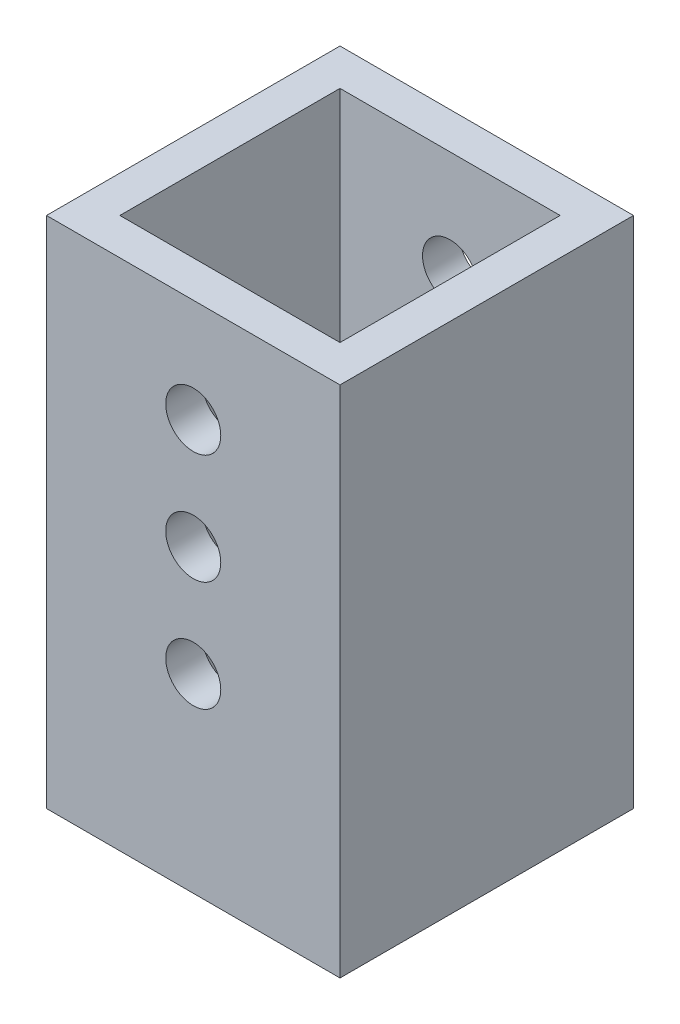
ISO-10303-21;
HEADER;
FILE_DESCRIPTION(('STEP AP214'),'2;1');
FILE_NAME('part.step','',(''),(''),'','','');
FILE_SCHEMA(('AUTOMOTIVE_DESIGN { 1 0 10303 214 1 1 1 1 }'));
ENDSEC;
DATA;
#1=APPLICATION_CONTEXT('core data for automotive mechanical design processes');
#2=APPLICATION_PROTOCOL_DEFINITION('international standard','automotive_design',2000,#1);
#3=PRODUCT_CONTEXT('',#1,'mechanical');
#4=PRODUCT('Part','Part','',(#3));
#5=PRODUCT_RELATED_PRODUCT_CATEGORY('part','',(#4));
#6=PRODUCT_DEFINITION_FORMATION('','',#4);
#7=PRODUCT_DEFINITION_CONTEXT('part definition',#1,'design');
#8=PRODUCT_DEFINITION('design','',#6,#7);
#9=PRODUCT_DEFINITION_SHAPE('','',#8);
#10=(LENGTH_UNIT() NAMED_UNIT(*) SI_UNIT(.MILLI.,.METRE.));
#11=(NAMED_UNIT(*) PLANE_ANGLE_UNIT() SI_UNIT($,.RADIAN.));
#12=(NAMED_UNIT(*) SI_UNIT($,.STERADIAN.) SOLID_ANGLE_UNIT());
#13=UNCERTAINTY_MEASURE_WITH_UNIT(LENGTH_MEASURE(1.E-05),#10,'distance_accuracy_value','');
#14=(GEOMETRIC_REPRESENTATION_CONTEXT(3) GLOBAL_UNCERTAINTY_ASSIGNED_CONTEXT((#13)) GLOBAL_UNIT_ASSIGNED_CONTEXT((#10,
#11,#12)) REPRESENTATION_CONTEXT('',''));
#15=CARTESIAN_POINT('',(0.,0.,0.));
#16=DIRECTION('',(0.,0.,1.));
#17=DIRECTION('',(1.,0.,0.));
#18=AXIS2_PLACEMENT_3D('',#15,#16,#17);
#19=CARTESIAN_POINT('',(-19.05,0.,-19.05));
#20=DIRECTION('',(-1.,0.,0.));
#21=DIRECTION('',(0.,0.,1.));
#22=AXIS2_PLACEMENT_3D('',#19,#20,#21);
#23=PLANE('',#22);
#24=DIRECTION('',(0.,0.,-1.));
#25=VECTOR('',#24,1.);
#26=CARTESIAN_POINT('',(-19.05,7.62,19.05));
#27=LINE('',#26,#25);
#28=CARTESIAN_POINT('',(-19.05,7.62,19.05));
#29=VERTEX_POINT('',#28);
#30=CARTESIAN_POINT('',(-19.05,7.62,-19.05));
#31=VERTEX_POINT('',#30);
#32=EDGE_CURVE('E52',#29,#31,#27,.T.);
#33=ORIENTED_EDGE('',*,*,#32,.T.);
#34=DIRECTION('',(0.,1.,0.));
#35=VECTOR('',#34,1.);
#36=CARTESIAN_POINT('',(-19.05,0.,-19.05));
#37=LINE('',#36,#35);
#38=CARTESIAN_POINT('',(-19.05,88.9,-19.05));
#39=VERTEX_POINT('',#38);
#40=EDGE_CURVE('E133',#31,#39,#37,.T.);
#41=ORIENTED_EDGE('',*,*,#40,.T.);
#42=DIRECTION('',(0.,0.,1.));
#43=VECTOR('',#42,1.);
#44=CARTESIAN_POINT('',(-19.05,88.9,-19.05));
#45=LINE('',#44,#43);
#46=CARTESIAN_POINT('',(-19.05,88.9,19.05));
#47=VERTEX_POINT('',#46);
#48=EDGE_CURVE('E121',#39,#47,#45,.T.);
#49=ORIENTED_EDGE('',*,*,#48,.T.);
#50=DIRECTION('',(0.,1.,0.));
#51=VECTOR('',#50,1.);
#52=CARTESIAN_POINT('',(-19.05,0.,19.05));
#53=LINE('',#52,#51);
#54=EDGE_CURVE('E113',#29,#47,#53,.T.);
#55=ORIENTED_EDGE('',*,*,#54,.F.);
#56=EDGE_LOOP('',(#33,#41,#49,#55));
#57=FACE_BOUND('',#56,.T.);
#58=ADVANCED_FACE('F36',(#57),#23,.F.);
#59=CARTESIAN_POINT('',(19.05,0.,-19.05));
#60=DIRECTION('',(0.,0.,-1.));
#61=DIRECTION('',(-1.,0.,0.));
#62=AXIS2_PLACEMENT_3D('',#59,#60,#61);
#63=PLANE('',#62);
#64=CARTESIAN_POINT('',(0.,70.9772729319091,-19.05));
#65=DIRECTION('',(0.,0.,-1.));
#66=DIRECTION('',(-1.,0.,0.));
#67=AXIS2_PLACEMENT_3D('',#64,#65,#66);
#68=CIRCLE('',#67,4.76249999999999);
#69=CARTESIAN_POINT('',(-4.76249999999999,70.9772729319091,-19.05));
#70=VERTEX_POINT('',#69);
#71=EDGE_CURVE('E253',#70,#70,#68,.T.);
#72=ORIENTED_EDGE('',*,*,#71,.T.);
#73=EDGE_LOOP('',(#72));
#74=FACE_BOUND('',#73,.T.);
#75=CARTESIAN_POINT('',(0.,51.9272729319091,-19.05));
#76=DIRECTION('',(0.,0.,-1.));
#77=DIRECTION('',(-1.,0.,0.));
#78=AXIS2_PLACEMENT_3D('',#75,#76,#77);
#79=CIRCLE('',#78,4.76249999999999);
#80=CARTESIAN_POINT('',(-4.76249999999999,51.9272729319091,-19.05));
#81=VERTEX_POINT('',#80);
#82=EDGE_CURVE('E254',#81,#81,#79,.T.);
#83=ORIENTED_EDGE('',*,*,#82,.T.);
#84=EDGE_LOOP('',(#83));
#85=FACE_BOUND('',#84,.T.);
#86=CARTESIAN_POINT('',(0.,32.8772729319091,-19.05));
#87=DIRECTION('',(0.,0.,-1.));
#88=DIRECTION('',(-1.,0.,0.));
#89=AXIS2_PLACEMENT_3D('',#86,#87,#88);
#90=CIRCLE('',#89,4.7625);
#91=CARTESIAN_POINT('',(-4.7625,32.8772729319091,-19.05));
#92=VERTEX_POINT('',#91);
#93=EDGE_CURVE('E271',#92,#92,#90,.T.);
#94=ORIENTED_EDGE('',*,*,#93,.T.);
#95=EDGE_LOOP('',(#94));
#96=FACE_BOUND('',#95,.T.);
#97=DIRECTION('',(1.,0.,0.));
#98=VECTOR('',#97,1.);
#99=CARTESIAN_POINT('',(-19.05,7.62,-19.05));
#100=LINE('',#99,#98);
#101=CARTESIAN_POINT('',(19.05,7.62,-19.05));
#102=VERTEX_POINT('',#101);
#103=EDGE_CURVE('E59',#31,#102,#100,.T.);
#104=ORIENTED_EDGE('',*,*,#103,.T.);
#105=DIRECTION('',(0.,1.,0.));
#106=VECTOR('',#105,1.);
#107=CARTESIAN_POINT('',(19.05,0.,-19.05));
#108=LINE('',#107,#106);
#109=CARTESIAN_POINT('',(19.05,88.9,-19.05));
#110=VERTEX_POINT('',#109);
#111=EDGE_CURVE('E112',#102,#110,#108,.T.);
#112=ORIENTED_EDGE('',*,*,#111,.T.);
#113=DIRECTION('',(-1.,0.,0.));
#114=VECTOR('',#113,1.);
#115=CARTESIAN_POINT('',(19.05,88.9,-19.05));
#116=LINE('',#115,#114);
#117=EDGE_CURVE('E130',#110,#39,#116,.T.);
#118=ORIENTED_EDGE('',*,*,#117,.T.);
#119=ORIENTED_EDGE('',*,*,#40,.F.);
#120=EDGE_LOOP('',(#104,#112,#118,#119));
#121=FACE_BOUND('',#120,.T.);
#122=ADVANCED_FACE('F198',(#74,#85,#96,#121),#63,.F.);
#123=CARTESIAN_POINT('',(19.05,0.,-19.05));
#124=DIRECTION('',(1.,0.,0.));
#125=DIRECTION('',(0.,0.,-1.));
#126=AXIS2_PLACEMENT_3D('',#123,#124,#125);
#127=PLANE('',#126);
#128=DIRECTION('',(0.,0.,1.));
#129=VECTOR('',#128,1.);
#130=CARTESIAN_POINT('',(19.05,7.62,19.05));
#131=LINE('',#130,#129);
#132=CARTESIAN_POINT('',(19.05,7.62,19.05));
#133=VERTEX_POINT('',#132);
#134=EDGE_CURVE('E116',#102,#133,#131,.T.);
#135=ORIENTED_EDGE('',*,*,#134,.T.);
#136=DIRECTION('',(0.,1.,0.));
#137=VECTOR('',#136,1.);
#138=CARTESIAN_POINT('',(19.05,0.,19.05));
#139=LINE('',#138,#137);
#140=CARTESIAN_POINT('',(19.05,88.9,19.05));
#141=VERTEX_POINT('',#140);
#142=EDGE_CURVE('E102',#133,#141,#139,.T.);
#143=ORIENTED_EDGE('',*,*,#142,.T.);
#144=DIRECTION('',(0.,0.,-1.));
#145=VECTOR('',#144,1.);
#146=CARTESIAN_POINT('',(19.05,88.9,-19.05));
#147=LINE('',#146,#145);
#148=EDGE_CURVE('E128',#141,#110,#147,.T.);
#149=ORIENTED_EDGE('',*,*,#148,.T.);
#150=ORIENTED_EDGE('',*,*,#111,.F.);
#151=EDGE_LOOP('',(#135,#143,#149,#150));
#152=FACE_BOUND('',#151,.T.);
#153=ADVANCED_FACE('F117',(#152),#127,.F.);
#154=CARTESIAN_POINT('',(19.05,0.,19.05));
#155=DIRECTION('',(0.,0.,1.));
#156=DIRECTION('',(1.,0.,0.));
#157=AXIS2_PLACEMENT_3D('',#154,#155,#156);
#158=PLANE('',#157);
#159=CARTESIAN_POINT('',(0.,70.9772729319091,19.05));
#160=DIRECTION('',(0.,0.,1.));
#161=DIRECTION('',(1.,0.,0.));
#162=AXIS2_PLACEMENT_3D('',#159,#160,#161);
#163=CIRCLE('',#162,4.76249999999999);
#164=CARTESIAN_POINT('',(4.76249999999999,70.9772729319091,19.05));
#165=VERTEX_POINT('',#164);
#166=EDGE_CURVE('E252',#165,#165,#163,.T.);
#167=ORIENTED_EDGE('',*,*,#166,.T.);
#168=EDGE_LOOP('',(#167));
#169=FACE_BOUND('',#168,.T.);
#170=CARTESIAN_POINT('',(0.,51.9272729319091,19.05));
#171=DIRECTION('',(0.,0.,1.));
#172=DIRECTION('',(1.,0.,0.));
#173=AXIS2_PLACEMENT_3D('',#170,#171,#172);
#174=CIRCLE('',#173,4.76249999999999);
#175=CARTESIAN_POINT('',(4.76249999999999,51.9272729319091,19.05));
#176=VERTEX_POINT('',#175);
#177=EDGE_CURVE('E260',#176,#176,#174,.T.);
#178=ORIENTED_EDGE('',*,*,#177,.T.);
#179=EDGE_LOOP('',(#178));
#180=FACE_BOUND('',#179,.T.);
#181=CARTESIAN_POINT('',(0.,32.8772729319091,19.05));
#182=DIRECTION('',(0.,0.,1.));
#183=DIRECTION('',(1.,0.,0.));
#184=AXIS2_PLACEMENT_3D('',#181,#182,#183);
#185=CIRCLE('',#184,4.7625);
#186=CARTESIAN_POINT('',(4.76250000000001,32.8772729319091,19.05));
#187=VERTEX_POINT('',#186);
#188=EDGE_CURVE('E274',#187,#187,#185,.T.);
#189=ORIENTED_EDGE('',*,*,#188,.T.);
#190=EDGE_LOOP('',(#189));
#191=FACE_BOUND('',#190,.T.);
#192=DIRECTION('',(-1.,0.,0.));
#193=VECTOR('',#192,1.);
#194=CARTESIAN_POINT('',(-19.05,7.62,19.05));
#195=LINE('',#194,#193);
#196=EDGE_CURVE('E106',#133,#29,#195,.T.);
#197=ORIENTED_EDGE('',*,*,#196,.T.);
#198=ORIENTED_EDGE('',*,*,#54,.T.);
#199=DIRECTION('',(1.,0.,0.));
#200=VECTOR('',#199,1.);
#201=CARTESIAN_POINT('',(19.05,88.9,19.05));
#202=LINE('',#201,#200);
#203=EDGE_CURVE('E108',#47,#141,#202,.T.);
#204=ORIENTED_EDGE('',*,*,#203,.T.);
#205=ORIENTED_EDGE('',*,*,#142,.F.);
#206=EDGE_LOOP('',(#197,#198,#204,#205));
#207=FACE_BOUND('',#206,.T.);
#208=ADVANCED_FACE('F104',(#169,#180,#191,#207),#158,.F.);
#209=CARTESIAN_POINT('',(-25.4,88.9,-25.4));
#210=DIRECTION('',(1.,0.,0.));
#211=DIRECTION('',(0.,0.,-1.));
#212=AXIS2_PLACEMENT_3D('',#209,#210,#211);
#213=PLANE('',#212);
#214=DIRECTION('',(0.,0.,1.));
#215=VECTOR('',#214,1.);
#216=CARTESIAN_POINT('',(-25.4,0.,-25.4));
#217=LINE('',#216,#215);
#218=CARTESIAN_POINT('',(-25.4,0.,-25.4));
#219=VERTEX_POINT('',#218);
#220=CARTESIAN_POINT('',(-25.4,0.,25.4));
#221=VERTEX_POINT('',#220);
#222=EDGE_CURVE('E135',#219,#221,#217,.T.);
#223=ORIENTED_EDGE('',*,*,#222,.T.);
#224=DIRECTION('',(0.,-1.,0.));
#225=VECTOR('',#224,1.);
#226=CARTESIAN_POINT('',(-25.4,88.9,25.4));
#227=LINE('',#226,#225);
#228=CARTESIAN_POINT('',(-25.4,88.9,25.4));
#229=VERTEX_POINT('',#228);
#230=EDGE_CURVE('E40',#229,#221,#227,.T.);
#231=ORIENTED_EDGE('',*,*,#230,.F.);
#232=DIRECTION('',(0.,0.,1.));
#233=VECTOR('',#232,1.);
#234=CARTESIAN_POINT('',(-25.4,88.9,-25.4));
#235=LINE('',#234,#233);
#236=CARTESIAN_POINT('',(-25.4,88.9,-25.4));
#237=VERTEX_POINT('',#236);
#238=EDGE_CURVE('E138',#237,#229,#235,.T.);
#239=ORIENTED_EDGE('',*,*,#238,.F.);
#240=DIRECTION('',(0.,-1.,0.));
#241=VECTOR('',#240,1.);
#242=CARTESIAN_POINT('',(-25.4,88.9,-25.4));
#243=LINE('',#242,#241);
#244=EDGE_CURVE('E148',#237,#219,#243,.T.);
#245=ORIENTED_EDGE('',*,*,#244,.T.);
#246=EDGE_LOOP('',(#223,#231,#239,#245));
#247=FACE_BOUND('',#246,.T.);
#248=ADVANCED_FACE('F38',(#247),#213,.F.);
#249=CARTESIAN_POINT('',(-25.4,88.9,25.4));
#250=DIRECTION('',(0.,0.,-1.));
#251=DIRECTION('',(-1.,0.,0.));
#252=AXIS2_PLACEMENT_3D('',#249,#250,#251);
#253=PLANE('',#252);
#254=CARTESIAN_POINT('',(0.,70.9772729319091,25.4));
#255=DIRECTION('',(0.,0.,1.));
#256=DIRECTION('',(1.,0.,0.));
#257=AXIS2_PLACEMENT_3D('',#254,#255,#256);
#258=CIRCLE('',#257,4.76249999999999);
#259=CARTESIAN_POINT('',(4.76249999999999,70.9772729319091,25.4));
#260=VERTEX_POINT('',#259);
#261=EDGE_CURVE('E249',#260,#260,#258,.T.);
#262=ORIENTED_EDGE('',*,*,#261,.F.);
#263=EDGE_LOOP('',(#262));
#264=FACE_BOUND('',#263,.T.);
#265=CARTESIAN_POINT('',(0.,51.9272729319091,25.4));
#266=DIRECTION('',(0.,0.,1.));
#267=DIRECTION('',(1.,0.,0.));
#268=AXIS2_PLACEMENT_3D('',#265,#266,#267);
#269=CIRCLE('',#268,4.76249999999999);
#270=CARTESIAN_POINT('',(4.76249999999999,51.9272729319091,25.4));
#271=VERTEX_POINT('',#270);
#272=EDGE_CURVE('E284',#271,#271,#269,.T.);
#273=ORIENTED_EDGE('',*,*,#272,.F.);
#274=EDGE_LOOP('',(#273));
#275=FACE_BOUND('',#274,.T.);
#276=CARTESIAN_POINT('',(0.,32.8772729319091,25.4));
#277=DIRECTION('',(0.,0.,1.));
#278=DIRECTION('',(1.,0.,0.));
#279=AXIS2_PLACEMENT_3D('',#276,#277,#278);
#280=CIRCLE('',#279,4.7625);
#281=CARTESIAN_POINT('',(4.76250000000001,32.8772729319091,25.4));
#282=VERTEX_POINT('',#281);
#283=EDGE_CURVE('E278',#282,#282,#280,.T.);
#284=ORIENTED_EDGE('',*,*,#283,.F.);
#285=EDGE_LOOP('',(#284));
#286=FACE_BOUND('',#285,.T.);
#287=DIRECTION('',(1.,0.,0.));
#288=VECTOR('',#287,1.);
#289=CARTESIAN_POINT('',(-25.4,0.,25.4));
#290=LINE('',#289,#288);
#291=CARTESIAN_POINT('',(25.4,0.,25.4));
#292=VERTEX_POINT('',#291);
#293=EDGE_CURVE('E151',#221,#292,#290,.T.);
#294=ORIENTED_EDGE('',*,*,#293,.T.);
#295=DIRECTION('',(0.,-1.,0.));
#296=VECTOR('',#295,1.);
#297=CARTESIAN_POINT('',(25.4,88.9,25.4));
#298=LINE('',#297,#296);
#299=CARTESIAN_POINT('',(25.4,88.9,25.4));
#300=VERTEX_POINT('',#299);
#301=EDGE_CURVE('E160',#300,#292,#298,.T.);
#302=ORIENTED_EDGE('',*,*,#301,.F.);
#303=DIRECTION('',(1.,0.,0.));
#304=VECTOR('',#303,1.);
#305=CARTESIAN_POINT('',(-25.4,88.9,25.4));
#306=LINE('',#305,#304);
#307=EDGE_CURVE('E141',#229,#300,#306,.T.);
#308=ORIENTED_EDGE('',*,*,#307,.F.);
#309=ORIENTED_EDGE('',*,*,#230,.T.);
#310=EDGE_LOOP('',(#294,#302,#308,#309));
#311=FACE_BOUND('',#310,.T.);
#312=ADVANCED_FACE('F169',(#264,#275,#286,#311),#253,.F.);
#313=CARTESIAN_POINT('',(25.4,88.9,-25.4));
#314=DIRECTION('',(-1.,0.,0.));
#315=DIRECTION('',(0.,0.,1.));
#316=AXIS2_PLACEMENT_3D('',#313,#314,#315);
#317=PLANE('',#316);
#318=DIRECTION('',(0.,0.,-1.));
#319=VECTOR('',#318,1.);
#320=CARTESIAN_POINT('',(25.4,0.,-25.4));
#321=LINE('',#320,#319);
#322=CARTESIAN_POINT('',(25.4,0.,-25.4));
#323=VERTEX_POINT('',#322);
#324=EDGE_CURVE('E153',#292,#323,#321,.T.);
#325=ORIENTED_EDGE('',*,*,#324,.T.);
#326=DIRECTION('',(0.,-1.,0.));
#327=VECTOR('',#326,1.);
#328=CARTESIAN_POINT('',(25.4,88.9,-25.4));
#329=LINE('',#328,#327);
#330=CARTESIAN_POINT('',(25.4,88.9,-25.4));
#331=VERTEX_POINT('',#330);
#332=EDGE_CURVE('E158',#331,#323,#329,.T.);
#333=ORIENTED_EDGE('',*,*,#332,.F.);
#334=DIRECTION('',(0.,0.,-1.));
#335=VECTOR('',#334,1.);
#336=CARTESIAN_POINT('',(25.4,88.9,-25.4));
#337=LINE('',#336,#335);
#338=EDGE_CURVE('E144',#300,#331,#337,.T.);
#339=ORIENTED_EDGE('',*,*,#338,.F.);
#340=ORIENTED_EDGE('',*,*,#301,.T.);
#341=EDGE_LOOP('',(#325,#333,#339,#340));
#342=FACE_BOUND('',#341,.T.);
#343=ADVANCED_FACE('F178',(#342),#317,.F.);
#344=CARTESIAN_POINT('',(-25.4,88.9,-25.4));
#345=DIRECTION('',(0.,0.,1.));
#346=DIRECTION('',(1.,0.,0.));
#347=AXIS2_PLACEMENT_3D('',#344,#345,#346);
#348=PLANE('',#347);
#349=CARTESIAN_POINT('',(0.,70.9772729319091,-25.4));
#350=DIRECTION('',(0.,0.,1.));
#351=DIRECTION('',(1.,0.,0.));
#352=AXIS2_PLACEMENT_3D('',#349,#350,#351);
#353=CIRCLE('',#352,4.76249999999999);
#354=CARTESIAN_POINT('',(4.76249999999999,70.9772729319091,-25.4));
#355=VERTEX_POINT('',#354);
#356=EDGE_CURVE('E277',#355,#355,#353,.T.);
#357=ORIENTED_EDGE('',*,*,#356,.T.);
#358=EDGE_LOOP('',(#357));
#359=FACE_BOUND('',#358,.T.);
#360=CARTESIAN_POINT('',(0.,51.9272729319091,-25.4));
#361=DIRECTION('',(0.,0.,1.));
#362=DIRECTION('',(1.,0.,0.));
#363=AXIS2_PLACEMENT_3D('',#360,#361,#362);
#364=CIRCLE('',#363,4.76249999999999);
#365=CARTESIAN_POINT('',(4.76249999999999,51.9272729319091,-25.4));
#366=VERTEX_POINT('',#365);
#367=EDGE_CURVE('E287',#366,#366,#364,.T.);
#368=ORIENTED_EDGE('',*,*,#367,.T.);
#369=EDGE_LOOP('',(#368));
#370=FACE_BOUND('',#369,.T.);
#371=CARTESIAN_POINT('',(0.,32.8772729319091,-25.4));
#372=DIRECTION('',(0.,0.,1.));
#373=DIRECTION('',(1.,0.,0.));
#374=AXIS2_PLACEMENT_3D('',#371,#372,#373);
#375=CIRCLE('',#374,4.7625);
#376=CARTESIAN_POINT('',(4.76250000000001,32.8772729319091,-25.4));
#377=VERTEX_POINT('',#376);
#378=EDGE_CURVE('E281',#377,#377,#375,.T.);
#379=ORIENTED_EDGE('',*,*,#378,.T.);
#380=EDGE_LOOP('',(#379));
#381=FACE_BOUND('',#380,.T.);
#382=DIRECTION('',(-1.,0.,0.));
#383=VECTOR('',#382,1.);
#384=CARTESIAN_POINT('',(-25.4,0.,-25.4));
#385=LINE('',#384,#383);
#386=EDGE_CURVE('E142',#323,#219,#385,.T.);
#387=ORIENTED_EDGE('',*,*,#386,.T.);
#388=ORIENTED_EDGE('',*,*,#244,.F.);
#389=DIRECTION('',(-1.,0.,0.));
#390=VECTOR('',#389,1.);
#391=CARTESIAN_POINT('',(-25.4,88.9,-25.4));
#392=LINE('',#391,#390);
#393=EDGE_CURVE('E146',#331,#237,#392,.T.);
#394=ORIENTED_EDGE('',*,*,#393,.F.);
#395=ORIENTED_EDGE('',*,*,#332,.T.);
#396=EDGE_LOOP('',(#387,#388,#394,#395));
#397=FACE_BOUND('',#396,.T.);
#398=ADVANCED_FACE('F181',(#359,#370,#381,#397),#348,.F.);
#399=CARTESIAN_POINT('',(0.,88.9,0.));
#400=DIRECTION('',(0.,1.,0.));
#401=DIRECTION('',(0.,0.,1.));
#402=AXIS2_PLACEMENT_3D('',#399,#400,#401);
#403=PLANE('',#402);
#404=ORIENTED_EDGE('',*,*,#48,.F.);
#405=ORIENTED_EDGE('',*,*,#117,.F.);
#406=ORIENTED_EDGE('',*,*,#148,.F.);
#407=ORIENTED_EDGE('',*,*,#203,.F.);
#408=EDGE_LOOP('',(#404,#405,#406,#407));
#409=FACE_BOUND('',#408,.T.);
#410=ORIENTED_EDGE('',*,*,#238,.T.);
#411=ORIENTED_EDGE('',*,*,#307,.T.);
#412=ORIENTED_EDGE('',*,*,#338,.T.);
#413=ORIENTED_EDGE('',*,*,#393,.T.);
#414=EDGE_LOOP('',(#410,#411,#412,#413));
#415=FACE_BOUND('',#414,.T.);
#416=ADVANCED_FACE('F183',(#409,#415),#403,.T.);
#417=CARTESIAN_POINT('',(0.,0.,0.));
#418=DIRECTION('',(0.,1.,0.));
#419=DIRECTION('',(0.,0.,1.));
#420=AXIS2_PLACEMENT_3D('',#417,#418,#419);
#421=PLANE('',#420);
#422=CARTESIAN_POINT('',(0.,0.,0.));
#423=DIRECTION('',(0.,-1.,0.));
#424=DIRECTION('',(0.,0.,-1.));
#425=AXIS2_PLACEMENT_3D('',#422,#423,#424);
#426=CIRCLE('',#425,6.35);
#427=CARTESIAN_POINT('',(0.,0.,6.35));
#428=VERTEX_POINT('',#427);
#429=EDGE_CURVE('E11',#428,#428,#426,.T.);
#430=ORIENTED_EDGE('',*,*,#429,.F.);
#431=EDGE_LOOP('',(#430));
#432=FACE_BOUND('',#431,.T.);
#433=ORIENTED_EDGE('',*,*,#222,.F.);
#434=ORIENTED_EDGE('',*,*,#386,.F.);
#435=ORIENTED_EDGE('',*,*,#324,.F.);
#436=ORIENTED_EDGE('',*,*,#293,.F.);
#437=EDGE_LOOP('',(#433,#434,#435,#436));
#438=FACE_BOUND('',#437,.T.);
#439=ADVANCED_FACE('F176',(#432,#438),#421,.F.);
#440=CARTESIAN_POINT('',(0.,7.62,0.));
#441=DIRECTION('',(0.,-1.,0.));
#442=DIRECTION('',(0.,0.,-1.));
#443=AXIS2_PLACEMENT_3D('',#440,#441,#442);
#444=PLANE('',#443);
#445=ORIENTED_EDGE('',*,*,#32,.F.);
#446=ORIENTED_EDGE('',*,*,#196,.F.);
#447=ORIENTED_EDGE('',*,*,#134,.F.);
#448=ORIENTED_EDGE('',*,*,#103,.F.);
#449=EDGE_LOOP('',(#445,#446,#447,#448));
#450=FACE_BOUND('',#449,.T.);
#451=ADVANCED_FACE('F120',(#450),#444,.F.);
#452=CARTESIAN_POINT('',(0.,-19.05,0.));
#453=DIRECTION('',(0.,1.,0.));
#454=DIRECTION('',(0.,0.,1.));
#455=AXIS2_PLACEMENT_3D('',#452,#453,#454);
#456=CYLINDRICAL_SURFACE('',#455,6.35);
#457=CARTESIAN_POINT('',(0.,-19.05,0.));
#458=DIRECTION('',(0.,-1.,0.));
#459=DIRECTION('',(0.,0.,-1.));
#460=AXIS2_PLACEMENT_3D('',#457,#458,#459);
#461=CIRCLE('',#460,6.35);
#462=CARTESIAN_POINT('',(0.,-19.05,6.35));
#463=VERTEX_POINT('',#462);
#464=EDGE_CURVE('E257',#463,#463,#461,.T.);
#465=CARTESIAN_POINT('',(0.,-19.05,6.35));
#466=CARTESIAN_POINT('',(0.,-18.8515625,6.35));
#467=CARTESIAN_POINT('',(0.,-18.653125,6.35));
#468=CARTESIAN_POINT('',(0.,-18.25625,6.35));
#469=CARTESIAN_POINT('',(0.,-18.0578125,6.35));
#470=CARTESIAN_POINT('',(0.,-17.6609375,6.35));
#471=CARTESIAN_POINT('',(0.,-17.4625,6.35));
#472=CARTESIAN_POINT('',(0.,-17.065625,6.35));
#473=CARTESIAN_POINT('',(0.,-16.8671875,6.35));
#474=CARTESIAN_POINT('',(0.,-16.4703125,6.35));
#475=CARTESIAN_POINT('',(0.,-16.271875,6.35));
#476=CARTESIAN_POINT('',(0.,-15.875,6.35));
#477=CARTESIAN_POINT('',(0.,-15.6765625,6.35));
#478=CARTESIAN_POINT('',(0.,-15.2796875,6.35));
#479=CARTESIAN_POINT('',(0.,-15.08125,6.35));
#480=CARTESIAN_POINT('',(0.,-14.684375,6.35));
#481=CARTESIAN_POINT('',(0.,-14.4859375,6.35));
#482=CARTESIAN_POINT('',(0.,-14.0890625,6.35));
#483=CARTESIAN_POINT('',(0.,-13.890625,6.35));
#484=CARTESIAN_POINT('',(0.,-13.49375,6.35));
#485=CARTESIAN_POINT('',(0.,-13.2953125,6.35));
#486=CARTESIAN_POINT('',(0.,-12.8984375,6.35));
#487=CARTESIAN_POINT('',(0.,-12.7,6.35));
#488=CARTESIAN_POINT('',(0.,-12.303125,6.35));
#489=CARTESIAN_POINT('',(0.,-12.1046875,6.35));
#490=CARTESIAN_POINT('',(0.,-11.7078125,6.35));
#491=CARTESIAN_POINT('',(0.,-11.509375,6.35));
#492=CARTESIAN_POINT('',(0.,-11.1125,6.35));
#493=CARTESIAN_POINT('',(0.,-10.9140625,6.35));
#494=CARTESIAN_POINT('',(0.,-10.5171875,6.35));
#495=CARTESIAN_POINT('',(0.,-10.31875,6.35));
#496=CARTESIAN_POINT('',(0.,-9.921875,6.35));
#497=CARTESIAN_POINT('',(0.,-9.7234375,6.35));
#498=CARTESIAN_POINT('',(0.,-9.3265625,6.35));
#499=CARTESIAN_POINT('',(0.,-9.128125,6.35));
#500=CARTESIAN_POINT('',(0.,-8.73125,6.35));
#501=CARTESIAN_POINT('',(0.,-8.5328125,6.35));
#502=CARTESIAN_POINT('',(0.,-8.1359375,6.35));
#503=CARTESIAN_POINT('',(0.,-7.9375,6.35));
#504=CARTESIAN_POINT('',(0.,-7.540625,6.35));
#505=CARTESIAN_POINT('',(0.,-7.3421875,6.35));
#506=CARTESIAN_POINT('',(0.,-6.9453125,6.35));
#507=CARTESIAN_POINT('',(0.,-6.746875,6.35));
#508=CARTESIAN_POINT('',(0.,-6.35,6.35));
#509=CARTESIAN_POINT('',(0.,-6.1515625,6.35));
#510=CARTESIAN_POINT('',(0.,-5.7546875,6.35));
#511=CARTESIAN_POINT('',(0.,-5.55625,6.35));
#512=CARTESIAN_POINT('',(0.,-5.159375,6.35));
#513=CARTESIAN_POINT('',(0.,-4.9609375,6.35));
#514=CARTESIAN_POINT('',(0.,-4.5640625,6.35));
#515=CARTESIAN_POINT('',(0.,-4.365625,6.35));
#516=CARTESIAN_POINT('',(0.,-3.96875,6.35));
#517=CARTESIAN_POINT('',(0.,-3.7703125,6.35));
#518=CARTESIAN_POINT('',(0.,-3.3734375,6.35));
#519=CARTESIAN_POINT('',(0.,-3.175,6.35));
#520=CARTESIAN_POINT('',(0.,-2.778125,6.35));
#521=CARTESIAN_POINT('',(0.,-2.5796875,6.35));
#522=CARTESIAN_POINT('',(0.,-2.1828125,6.35));
#523=CARTESIAN_POINT('',(0.,-1.984375,6.35));
#524=CARTESIAN_POINT('',(0.,-1.5875,6.35));
#525=CARTESIAN_POINT('',(0.,-1.3890625,6.35));
#526=CARTESIAN_POINT('',(0.,-0.992187500000001,6.35));
#527=CARTESIAN_POINT('',(0.,-0.793750000000001,6.35));
#528=CARTESIAN_POINT('',(0.,-0.396875,6.35));
#529=CARTESIAN_POINT('',(0.,-0.1984375,6.35));
#530=CARTESIAN_POINT('',(0.,0.,6.35));
#531=B_SPLINE_CURVE_WITH_KNOTS('',3,(#465,#466,#467,#468,#469,#470,#471,#472,#473,#474,#475,
#476,#477,#478,#479,#480,#481,#482,#483,#484,#485,#486,#487,#488,#489,#490,#491,#492,#493,#494,
#495,#496,#497,#498,#499,#500,#501,#502,#503,#504,#505,#506,#507,#508,#509,#510,#511,#512,#513,
#514,#515,#516,#517,#518,#519,#520,#521,#522,#523,#524,#525,#526,#527,#528,#529,#530),
.UNSPECIFIED.,.F.,.F.,(4,2,2,2,2,2,2,2,2,2,2,2,2,2,2,2,2,2,2,2,2,2,2,2,2,2,2,2,2,2,2,2,4),(0.,
0.5953125,1.190625,1.7859375,2.38125,2.9765625,3.571875,4.1671875,4.7625,5.3578125,5.953125,
6.5484375,7.14375,7.7390625,8.334375,8.9296875,9.525,10.1203125,10.715625,11.3109375,11.90625,
12.5015625,13.096875,13.6921875,14.2875,14.8828125,15.478125,16.0734375,16.66875,17.2640625,
17.859375,18.4546875,19.05),.UNSPECIFIED.);
#532=EDGE_CURVE('BSEAM212',#463,#428,#531,.T.);
#533=ORIENTED_EDGE('',*,*,#464,.F.);
#534=ORIENTED_EDGE('',*,*,#429,.T.);
#535=ORIENTED_EDGE('',*,*,#532,.T.);
#536=ORIENTED_EDGE('',*,*,#532,.F.);
#537=EDGE_LOOP('',(#533,#535,#534,#536));
#538=FACE_BOUND('',#537,.T.);
#539=ADVANCED_FACE('F212',(#538),#456,.T.);
#540=CARTESIAN_POINT('',(0.,-19.05,0.));
#541=DIRECTION('',(0.,-1.,0.));
#542=DIRECTION('',(0.,0.,-1.));
#543=AXIS2_PLACEMENT_3D('',#540,#541,#542);
#544=PLANE('',#543);
#545=ORIENTED_EDGE('',*,*,#464,.T.);
#546=EDGE_LOOP('',(#545));
#547=FACE_BOUND('',#546,.T.);
#548=ADVANCED_FACE('F215',(#547),#544,.T.);
#549=CARTESIAN_POINT('',(0.,32.8772729319091,-25.4));
#550=DIRECTION('',(0.,0.,1.));
#551=DIRECTION('',(1.,0.,0.));
#552=AXIS2_PLACEMENT_3D('',#549,#550,#551);
#553=CYLINDRICAL_SURFACE('',#552,4.7625);
#554=ORIENTED_EDGE('',*,*,#378,.F.);
#555=EDGE_LOOP('',(#554));
#556=FACE_BOUND('',#555,.T.);
#557=ORIENTED_EDGE('',*,*,#93,.F.);
#558=EDGE_LOOP('',(#557));
#559=FACE_BOUND('',#558,.T.);
#560=ADVANCED_FACE('F219',(#556,#559),#553,.F.);
#561=CARTESIAN_POINT('',(0.,51.9272729319091,-25.4));
#562=DIRECTION('',(0.,0.,1.));
#563=DIRECTION('',(1.,0.,0.));
#564=AXIS2_PLACEMENT_3D('',#561,#562,#563);
#565=CYLINDRICAL_SURFACE('',#564,4.76249999999999);
#566=ORIENTED_EDGE('',*,*,#367,.F.);
#567=EDGE_LOOP('',(#566));
#568=FACE_BOUND('',#567,.T.);
#569=ORIENTED_EDGE('',*,*,#82,.F.);
#570=EDGE_LOOP('',(#569));
#571=FACE_BOUND('',#570,.T.);
#572=ADVANCED_FACE('F223',(#568,#571),#565,.F.);
#573=CARTESIAN_POINT('',(0.,70.9772729319091,-25.4));
#574=DIRECTION('',(0.,0.,1.));
#575=DIRECTION('',(1.,0.,0.));
#576=AXIS2_PLACEMENT_3D('',#573,#574,#575);
#577=CYLINDRICAL_SURFACE('',#576,4.76249999999999);
#578=ORIENTED_EDGE('',*,*,#356,.F.);
#579=EDGE_LOOP('',(#578));
#580=FACE_BOUND('',#579,.T.);
#581=ORIENTED_EDGE('',*,*,#71,.F.);
#582=EDGE_LOOP('',(#581));
#583=FACE_BOUND('',#582,.T.);
#584=ADVANCED_FACE('F228',(#580,#583),#577,.F.);
#585=ORIENTED_EDGE('',*,*,#283,.T.);
#586=EDGE_LOOP('',(#585));
#587=FACE_BOUND('',#586,.T.);
#588=ORIENTED_EDGE('',*,*,#188,.F.);
#589=EDGE_LOOP('',(#588));
#590=FACE_BOUND('',#589,.T.);
#591=ADVANCED_FACE('F225',(#587,#590),#553,.F.);
#592=ORIENTED_EDGE('',*,*,#272,.T.);
#593=EDGE_LOOP('',(#592));
#594=FACE_BOUND('',#593,.T.);
#595=ORIENTED_EDGE('',*,*,#177,.F.);
#596=EDGE_LOOP('',(#595));
#597=FACE_BOUND('',#596,.T.);
#598=ADVANCED_FACE('F230',(#594,#597),#565,.F.);
#599=ORIENTED_EDGE('',*,*,#261,.T.);
#600=EDGE_LOOP('',(#599));
#601=FACE_BOUND('',#600,.T.);
#602=ORIENTED_EDGE('',*,*,#166,.F.);
#603=EDGE_LOOP('',(#602));
#604=FACE_BOUND('',#603,.T.);
#605=ADVANCED_FACE('F233',(#601,#604),#577,.F.);
#606=CLOSED_SHELL('',(#58,#122,#153,#208,#248,#312,#343,#398,#416,#439,#451,#539,#548,#560,#572,
#584,#591,#598,#605));
#607=MANIFOLD_SOLID_BREP('B2',#606);
#608=ADVANCED_BREP_SHAPE_REPRESENTATION('',(#18,#607),#14);
#609=SHAPE_DEFINITION_REPRESENTATION(#9,#608);
ENDSEC;
END-ISO-10303-21;
